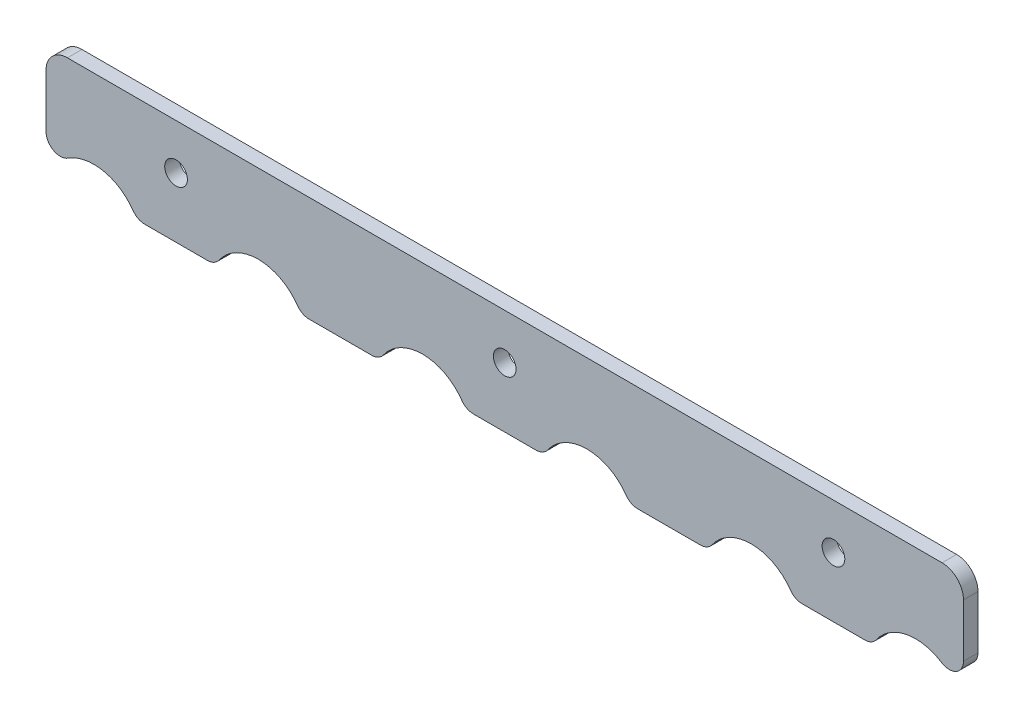
ISO-10303-21;
HEADER;
FILE_DESCRIPTION(('STEP AP214'),'2;1');
FILE_NAME('part.step','',(''),(''),'','','');
FILE_SCHEMA(('AUTOMOTIVE_DESIGN { 1 0 10303 214 1 1 1 1 }'));
ENDSEC;
DATA;
#1=APPLICATION_CONTEXT('core data for automotive mechanical design processes');
#2=APPLICATION_PROTOCOL_DEFINITION('international standard','automotive_design',2000,#1);
#3=PRODUCT_CONTEXT('',#1,'mechanical');
#4=PRODUCT('Part','Part','',(#3));
#5=PRODUCT_RELATED_PRODUCT_CATEGORY('part','',(#4));
#6=PRODUCT_DEFINITION_FORMATION('','',#4);
#7=PRODUCT_DEFINITION_CONTEXT('part definition',#1,'design');
#8=PRODUCT_DEFINITION('design','',#6,#7);
#9=PRODUCT_DEFINITION_SHAPE('','',#8);
#10=(LENGTH_UNIT() NAMED_UNIT(*) SI_UNIT(.MILLI.,.METRE.));
#11=(NAMED_UNIT(*) PLANE_ANGLE_UNIT() SI_UNIT($,.RADIAN.));
#12=(NAMED_UNIT(*) SI_UNIT($,.STERADIAN.) SOLID_ANGLE_UNIT());
#13=UNCERTAINTY_MEASURE_WITH_UNIT(LENGTH_MEASURE(1.E-05),#10,'distance_accuracy_value','');
#14=(GEOMETRIC_REPRESENTATION_CONTEXT(3) GLOBAL_UNCERTAINTY_ASSIGNED_CONTEXT((#13)) GLOBAL_UNIT_ASSIGNED_CONTEXT((#10,
#11,#12)) REPRESENTATION_CONTEXT('',''));
#15=CARTESIAN_POINT('',(0.,0.,0.));
#16=DIRECTION('',(0.,0.,1.));
#17=DIRECTION('',(1.,0.,0.));
#18=AXIS2_PLACEMENT_3D('',#15,#16,#17);
#19=CARTESIAN_POINT('',(125.775,10.775,2.032));
#20=DIRECTION('',(0.,0.,-1.));
#21=DIRECTION('',(-1.,0.,0.));
#22=AXIS2_PLACEMENT_3D('',#19,#20,#21);
#23=CYLINDRICAL_SURFACE('',#22,6.7);
#24=CARTESIAN_POINT('',(125.775,10.775,0.));
#25=DIRECTION('',(0.,0.,1.));
#26=DIRECTION('',(1.,0.,0.));
#27=AXIS2_PLACEMENT_3D('',#24,#25,#26);
#28=CIRCLE('',#27,6.7);
#29=CARTESIAN_POINT('',(129.394540229885,16.41316712454,0.));
#30=VERTEX_POINT('',#29);
#31=CARTESIAN_POINT('',(120.292019571223,14.6255747126437,0.));
#32=VERTEX_POINT('',#31);
#33=EDGE_CURVE('E464',#30,#32,#28,.T.);
#34=ORIENTED_EDGE('',*,*,#33,.F.);
#35=DIRECTION('',(0.,0.,-1.));
#36=VECTOR('',#35,1.);
#37=CARTESIAN_POINT('',(129.394540229885,16.41316712454,2.032));
#38=LINE('',#37,#36);
#39=CARTESIAN_POINT('',(129.394540229885,16.41316712454,2.032));
#40=VERTEX_POINT('',#39);
#41=EDGE_CURVE('E306',#30,#40,#38,.F.);
#42=ORIENTED_EDGE('',*,*,#41,.T.);
#43=CARTESIAN_POINT('',(125.775,10.775,2.032));
#44=DIRECTION('',(0.,0.,1.));
#45=DIRECTION('',(1.,0.,0.));
#46=AXIS2_PLACEMENT_3D('',#43,#44,#45);
#47=CIRCLE('',#46,6.7);
#48=CARTESIAN_POINT('',(120.292019571223,14.6255747126437,2.032));
#49=VERTEX_POINT('',#48);
#50=EDGE_CURVE('E411',#40,#49,#47,.T.);
#51=ORIENTED_EDGE('',*,*,#50,.T.);
#52=DIRECTION('',(0.,0.,-1.));
#53=VECTOR('',#52,1.);
#54=CARTESIAN_POINT('',(120.292019571223,14.6255747126437,2.032));
#55=LINE('',#54,#53);
#56=EDGE_CURVE('E303',#49,#32,#55,.T.);
#57=ORIENTED_EDGE('',*,*,#56,.T.);
#58=EDGE_LOOP('',(#34,#42,#51,#57));
#59=FACE_BOUND('',#58,.T.);
#60=ADVANCED_FACE('F43',(#59),#23,.F.);
#61=CARTESIAN_POINT('',(132.475,0.,2.032));
#62=DIRECTION('',(1.,0.,0.));
#63=DIRECTION('',(0.,0.,-1.));
#64=AXIS2_PLACEMENT_3D('',#61,#62,#63);
#65=PLANE('',#64);
#66=DIRECTION('',(0.,-1.,0.));
#67=VECTOR('',#66,1.);
#68=CARTESIAN_POINT('',(132.475,0.,2.032));
#69=LINE('',#68,#67);
#70=CARTESIAN_POINT('',(132.475,25.535,2.032));
#71=VERTEX_POINT('',#70);
#72=CARTESIAN_POINT('',(132.475,18.0962020870892,2.032));
#73=VERTEX_POINT('',#72);
#74=EDGE_CURVE('E415',#71,#73,#69,.T.);
#75=ORIENTED_EDGE('',*,*,#74,.T.);
#76=DIRECTION('',(0.,0.,-1.));
#77=VECTOR('',#76,1.);
#78=CARTESIAN_POINT('',(132.475,18.0962020870892,2.032));
#79=LINE('',#78,#77);
#80=CARTESIAN_POINT('',(132.475,18.0962020870892,0.));
#81=VERTEX_POINT('',#80);
#82=EDGE_CURVE('E277',#73,#81,#79,.T.);
#83=ORIENTED_EDGE('',*,*,#82,.T.);
#84=DIRECTION('',(0.,-1.,0.));
#85=VECTOR('',#84,1.);
#86=CARTESIAN_POINT('',(132.475,0.,0.));
#87=LINE('',#86,#85);
#88=CARTESIAN_POINT('',(132.475,25.535,0.));
#89=VERTEX_POINT('',#88);
#90=EDGE_CURVE('E467',#89,#81,#87,.T.);
#91=ORIENTED_EDGE('',*,*,#90,.F.);
#92=DIRECTION('',(0.,0.,-1.));
#93=VECTOR('',#92,1.);
#94=CARTESIAN_POINT('',(132.475,25.535,2.032));
#95=LINE('',#94,#93);
#96=EDGE_CURVE('E275',#89,#71,#95,.F.);
#97=ORIENTED_EDGE('',*,*,#96,.T.);
#98=EDGE_LOOP('',(#75,#83,#91,#97));
#99=FACE_BOUND('',#98,.T.);
#100=ADVANCED_FACE('F484',(#99),#65,.T.);
#101=CARTESIAN_POINT('',(0.,28.535,2.032));
#102=DIRECTION('',(0.,1.,0.));
#103=DIRECTION('',(0.,0.,1.));
#104=AXIS2_PLACEMENT_3D('',#101,#102,#103);
#105=PLANE('',#104);
#106=DIRECTION('',(1.,0.,0.));
#107=VECTOR('',#106,1.);
#108=CARTESIAN_POINT('',(0.,28.535,0.));
#109=LINE('',#108,#107);
#110=CARTESIAN_POINT('',(7.075,28.535,0.));
#111=VERTEX_POINT('',#110);
#112=CARTESIAN_POINT('',(129.475,28.535,0.));
#113=VERTEX_POINT('',#112);
#114=EDGE_CURVE('E241',#111,#113,#109,.T.);
#115=ORIENTED_EDGE('',*,*,#114,.F.);
#116=DIRECTION('',(0.,0.,-1.));
#117=VECTOR('',#116,1.);
#118=CARTESIAN_POINT('',(7.075,28.535,2.032));
#119=LINE('',#118,#117);
#120=CARTESIAN_POINT('',(7.075,28.535,2.032));
#121=VERTEX_POINT('',#120);
#122=EDGE_CURVE('E249',#111,#121,#119,.F.);
#123=ORIENTED_EDGE('',*,*,#122,.T.);
#124=DIRECTION('',(1.,0.,0.));
#125=VECTOR('',#124,1.);
#126=CARTESIAN_POINT('',(0.,28.535,2.032));
#127=LINE('',#126,#125);
#128=CARTESIAN_POINT('',(129.475,28.535,2.032));
#129=VERTEX_POINT('',#128);
#130=EDGE_CURVE('E476',#121,#129,#127,.T.);
#131=ORIENTED_EDGE('',*,*,#130,.T.);
#132=DIRECTION('',(0.,0.,-1.));
#133=VECTOR('',#132,1.);
#134=CARTESIAN_POINT('',(129.475,28.535,2.032));
#135=LINE('',#134,#133);
#136=EDGE_CURVE('E250',#129,#113,#135,.T.);
#137=ORIENTED_EDGE('',*,*,#136,.T.);
#138=EDGE_LOOP('',(#115,#123,#131,#137));
#139=FACE_BOUND('',#138,.T.);
#140=ADVANCED_FACE('F472',(#139),#105,.T.);
#141=CARTESIAN_POINT('',(4.075,0.,2.032));
#142=DIRECTION('',(-1.,0.,0.));
#143=DIRECTION('',(0.,0.,1.));
#144=AXIS2_PLACEMENT_3D('',#141,#142,#143);
#145=PLANE('',#144);
#146=DIRECTION('',(0.,1.,0.));
#147=VECTOR('',#146,1.);
#148=CARTESIAN_POINT('',(4.075,0.,0.));
#149=LINE('',#148,#147);
#150=CARTESIAN_POINT('',(4.075,18.0962020870892,0.));
#151=VERTEX_POINT('',#150);
#152=CARTESIAN_POINT('',(4.075,25.535,0.));
#153=VERTEX_POINT('',#152);
#154=EDGE_CURVE('E228',#151,#153,#149,.T.);
#155=ORIENTED_EDGE('',*,*,#154,.F.);
#156=DIRECTION('',(0.,0.,-1.));
#157=VECTOR('',#156,1.);
#158=CARTESIAN_POINT('',(4.075,18.0962020870892,2.032));
#159=LINE('',#158,#157);
#160=CARTESIAN_POINT('',(4.075,18.0962020870892,2.032));
#161=VERTEX_POINT('',#160);
#162=EDGE_CURVE('E11',#151,#161,#159,.F.);
#163=ORIENTED_EDGE('',*,*,#162,.T.);
#164=DIRECTION('',(0.,1.,0.));
#165=VECTOR('',#164,1.);
#166=CARTESIAN_POINT('',(4.075,0.,2.032));
#167=LINE('',#166,#165);
#168=CARTESIAN_POINT('',(4.075,25.535,2.032));
#169=VERTEX_POINT('',#168);
#170=EDGE_CURVE('E255',#161,#169,#167,.T.);
#171=ORIENTED_EDGE('',*,*,#170,.T.);
#172=DIRECTION('',(0.,0.,-1.));
#173=VECTOR('',#172,1.);
#174=CARTESIAN_POINT('',(4.075,25.535,2.032));
#175=LINE('',#174,#173);
#176=EDGE_CURVE('E248',#169,#153,#175,.T.);
#177=ORIENTED_EDGE('',*,*,#176,.T.);
#178=EDGE_LOOP('',(#155,#163,#171,#177));
#179=FACE_BOUND('',#178,.T.);
#180=ADVANCED_FACE('F253',(#179),#145,.T.);
#181=CARTESIAN_POINT('',(10.775,10.775,2.032));
#182=DIRECTION('',(0.,0.,-1.));
#183=DIRECTION('',(-1.,0.,0.));
#184=AXIS2_PLACEMENT_3D('',#181,#182,#183);
#185=CYLINDRICAL_SURFACE('',#184,6.7);
#186=CARTESIAN_POINT('',(10.775,10.775,0.));
#187=DIRECTION('',(0.,0.,1.));
#188=DIRECTION('',(1.,0.,0.));
#189=AXIS2_PLACEMENT_3D('',#186,#187,#188);
#190=CIRCLE('',#189,6.7);
#191=CARTESIAN_POINT('',(16.2579804287768,14.6255747126437,0.));
#192=VERTEX_POINT('',#191);
#193=CARTESIAN_POINT('',(7.15545977011494,16.41316712454,0.));
#194=VERTEX_POINT('',#193);
#195=EDGE_CURVE('E240',#192,#194,#190,.T.);
#196=ORIENTED_EDGE('',*,*,#195,.F.);
#197=DIRECTION('',(0.,0.,-1.));
#198=VECTOR('',#197,1.);
#199=CARTESIAN_POINT('',(16.2579804287768,14.6255747126437,2.032));
#200=LINE('',#199,#198);
#201=CARTESIAN_POINT('',(16.2579804287768,14.6255747126437,2.032));
#202=VERTEX_POINT('',#201);
#203=EDGE_CURVE('E51',#192,#202,#200,.F.);
#204=ORIENTED_EDGE('',*,*,#203,.T.);
#205=CARTESIAN_POINT('',(10.775,10.775,2.032));
#206=DIRECTION('',(0.,0.,1.));
#207=DIRECTION('',(1.,0.,0.));
#208=AXIS2_PLACEMENT_3D('',#205,#206,#207);
#209=CIRCLE('',#208,6.7);
#210=CARTESIAN_POINT('',(7.15545977011494,16.41316712454,2.032));
#211=VERTEX_POINT('',#210);
#212=EDGE_CURVE('E383',#202,#211,#209,.T.);
#213=ORIENTED_EDGE('',*,*,#212,.T.);
#214=DIRECTION('',(0.,0.,-1.));
#215=VECTOR('',#214,1.);
#216=CARTESIAN_POINT('',(7.15545977011494,16.41316712454,2.032));
#217=LINE('',#216,#215);
#218=EDGE_CURVE('E375',#211,#194,#217,.T.);
#219=ORIENTED_EDGE('',*,*,#218,.T.);
#220=EDGE_LOOP('',(#196,#204,#213,#219));
#221=FACE_BOUND('',#220,.T.);
#222=ADVANCED_FACE('F382',(#221),#185,.F.);
#223=CARTESIAN_POINT('',(0.,13.775,2.032));
#224=DIRECTION('',(0.,1.,0.));
#225=DIRECTION('',(0.,0.,1.));
#226=AXIS2_PLACEMENT_3D('',#223,#224,#225);
#227=PLANE('',#226);
#228=DIRECTION('',(1.,0.,0.));
#229=VECTOR('',#228,1.);
#230=CARTESIAN_POINT('',(0.,13.775,0.));
#231=LINE('',#230,#229);
#232=CARTESIAN_POINT('',(17.894691004531,13.775,0.));
#233=VERTEX_POINT('',#232);
#234=CARTESIAN_POINT('',(26.655308995469,13.775,0.));
#235=VERTEX_POINT('',#234);
#236=EDGE_CURVE('E399',#233,#235,#231,.T.);
#237=ORIENTED_EDGE('',*,*,#236,.T.);
#238=DIRECTION('',(0.,0.,1.));
#239=VECTOR('',#238,1.);
#240=CARTESIAN_POINT('',(26.655308995469,13.775,2.032));
#241=LINE('',#240,#239);
#242=CARTESIAN_POINT('',(26.655308995469,13.775,2.032));
#243=VERTEX_POINT('',#242);
#244=EDGE_CURVE('E373',#235,#243,#241,.T.);
#245=ORIENTED_EDGE('',*,*,#244,.T.);
#246=DIRECTION('',(1.,0.,0.));
#247=VECTOR('',#246,1.);
#248=CARTESIAN_POINT('',(0.,13.775,2.032));
#249=LINE('',#248,#247);
#250=CARTESIAN_POINT('',(17.894691004531,13.775,2.032));
#251=VERTEX_POINT('',#250);
#252=EDGE_CURVE('E263',#251,#243,#249,.T.);
#253=ORIENTED_EDGE('',*,*,#252,.F.);
#254=DIRECTION('',(0.,0.,1.));
#255=VECTOR('',#254,1.);
#256=CARTESIAN_POINT('',(17.894691004531,13.775,0.));
#257=LINE('',#256,#255);
#258=EDGE_CURVE('E370',#251,#233,#257,.F.);
#259=ORIENTED_EDGE('',*,*,#258,.T.);
#260=EDGE_LOOP('',(#237,#245,#253,#259));
#261=FACE_BOUND('',#260,.T.);
#262=ADVANCED_FACE('F398',(#261),#227,.F.);
#263=CARTESIAN_POINT('',(33.775,10.775,2.032));
#264=DIRECTION('',(0.,0.,-1.));
#265=DIRECTION('',(-1.,0.,0.));
#266=AXIS2_PLACEMENT_3D('',#263,#264,#265);
#267=CYLINDRICAL_SURFACE('',#266,6.7);
#268=CARTESIAN_POINT('',(33.775,10.775,0.));
#269=DIRECTION('',(0.,0.,1.));
#270=DIRECTION('',(1.,0.,0.));
#271=AXIS2_PLACEMENT_3D('',#268,#269,#270);
#272=CIRCLE('',#271,6.7);
#273=CARTESIAN_POINT('',(39.2579804287768,14.6255747126437,0.));
#274=VERTEX_POINT('',#273);
#275=CARTESIAN_POINT('',(28.2920195712232,14.6255747126437,0.));
#276=VERTEX_POINT('',#275);
#277=EDGE_CURVE('E402',#274,#276,#272,.T.);
#278=ORIENTED_EDGE('',*,*,#277,.F.);
#279=DIRECTION('',(0.,0.,-1.));
#280=VECTOR('',#279,1.);
#281=CARTESIAN_POINT('',(39.2579804287768,14.6255747126437,2.032));
#282=LINE('',#281,#280);
#283=CARTESIAN_POINT('',(39.2579804287768,14.6255747126437,2.032));
#284=VERTEX_POINT('',#283);
#285=EDGE_CURVE('E368',#274,#284,#282,.F.);
#286=ORIENTED_EDGE('',*,*,#285,.T.);
#287=CARTESIAN_POINT('',(33.775,10.775,2.032));
#288=DIRECTION('',(0.,0.,1.));
#289=DIRECTION('',(1.,0.,0.));
#290=AXIS2_PLACEMENT_3D('',#287,#288,#289);
#291=CIRCLE('',#290,6.7);
#292=CARTESIAN_POINT('',(28.2920195712232,14.6255747126437,2.032));
#293=VERTEX_POINT('',#292);
#294=EDGE_CURVE('E455',#284,#293,#291,.T.);
#295=ORIENTED_EDGE('',*,*,#294,.T.);
#296=DIRECTION('',(0.,0.,-1.));
#297=VECTOR('',#296,1.);
#298=CARTESIAN_POINT('',(28.2920195712232,14.6255747126437,2.032));
#299=LINE('',#298,#297);
#300=EDGE_CURVE('E365',#293,#276,#299,.T.);
#301=ORIENTED_EDGE('',*,*,#300,.T.);
#302=EDGE_LOOP('',(#278,#286,#295,#301));
#303=FACE_BOUND('',#302,.T.);
#304=ADVANCED_FACE('F757',(#303),#267,.F.);
#305=CARTESIAN_POINT('',(40.894691004531,13.775,0.));
#306=VERTEX_POINT('',#305);
#307=CARTESIAN_POINT('',(49.655308995469,13.775,0.));
#308=VERTEX_POINT('',#307);
#309=EDGE_CURVE('E404',#306,#308,#231,.T.);
#310=ORIENTED_EDGE('',*,*,#309,.T.);
#311=DIRECTION('',(0.,0.,1.));
#312=VECTOR('',#311,1.);
#313=CARTESIAN_POINT('',(49.655308995469,13.775,2.032));
#314=LINE('',#313,#312);
#315=CARTESIAN_POINT('',(49.655308995469,13.775,2.032));
#316=VERTEX_POINT('',#315);
#317=EDGE_CURVE('E363',#308,#316,#314,.T.);
#318=ORIENTED_EDGE('',*,*,#317,.T.);
#319=CARTESIAN_POINT('',(40.894691004531,13.775,2.032));
#320=VERTEX_POINT('',#319);
#321=EDGE_CURVE('E449',#320,#316,#249,.T.);
#322=ORIENTED_EDGE('',*,*,#321,.F.);
#323=DIRECTION('',(0.,0.,1.));
#324=VECTOR('',#323,1.);
#325=CARTESIAN_POINT('',(40.894691004531,13.775,0.));
#326=LINE('',#325,#324);
#327=EDGE_CURVE('E360',#320,#306,#326,.F.);
#328=ORIENTED_EDGE('',*,*,#327,.T.);
#329=EDGE_LOOP('',(#310,#318,#322,#328));
#330=FACE_BOUND('',#329,.T.);
#331=ADVANCED_FACE('F743',(#330),#227,.F.);
#332=CARTESIAN_POINT('',(56.775,10.775,2.032));
#333=DIRECTION('',(0.,0.,-1.));
#334=DIRECTION('',(-1.,0.,0.));
#335=AXIS2_PLACEMENT_3D('',#332,#333,#334);
#336=CYLINDRICAL_SURFACE('',#335,6.70000000000001);
#337=CARTESIAN_POINT('',(56.775,10.775,0.));
#338=DIRECTION('',(0.,0.,1.));
#339=DIRECTION('',(1.,0.,0.));
#340=AXIS2_PLACEMENT_3D('',#337,#338,#339);
#341=CIRCLE('',#340,6.70000000000001);
#342=CARTESIAN_POINT('',(62.2579804287768,14.6255747126437,0.));
#343=VERTEX_POINT('',#342);
#344=CARTESIAN_POINT('',(51.2920195712232,14.6255747126437,0.));
#345=VERTEX_POINT('',#344);
#346=EDGE_CURVE('E409',#343,#345,#341,.T.);
#347=ORIENTED_EDGE('',*,*,#346,.F.);
#348=DIRECTION('',(0.,0.,-1.));
#349=VECTOR('',#348,1.);
#350=CARTESIAN_POINT('',(62.2579804287768,14.6255747126437,2.032));
#351=LINE('',#350,#349);
#352=CARTESIAN_POINT('',(62.2579804287768,14.6255747126437,2.032));
#353=VERTEX_POINT('',#352);
#354=EDGE_CURVE('E358',#343,#353,#351,.F.);
#355=ORIENTED_EDGE('',*,*,#354,.T.);
#356=CARTESIAN_POINT('',(56.775,10.775,2.032));
#357=DIRECTION('',(0.,0.,1.));
#358=DIRECTION('',(1.,0.,0.));
#359=AXIS2_PLACEMENT_3D('',#356,#357,#358);
#360=CIRCLE('',#359,6.70000000000001);
#361=CARTESIAN_POINT('',(51.2920195712232,14.6255747126437,2.032));
#362=VERTEX_POINT('',#361);
#363=EDGE_CURVE('E446',#353,#362,#360,.T.);
#364=ORIENTED_EDGE('',*,*,#363,.T.);
#365=DIRECTION('',(0.,0.,-1.));
#366=VECTOR('',#365,1.);
#367=CARTESIAN_POINT('',(51.2920195712232,14.6255747126437,2.032));
#368=LINE('',#367,#366);
#369=EDGE_CURVE('E355',#362,#345,#368,.T.);
#370=ORIENTED_EDGE('',*,*,#369,.T.);
#371=EDGE_LOOP('',(#347,#355,#364,#370));
#372=FACE_BOUND('',#371,.T.);
#373=ADVANCED_FACE('F434',(#372),#336,.F.);
#374=CARTESIAN_POINT('',(63.894691004531,13.775,0.));
#375=VERTEX_POINT('',#374);
#376=CARTESIAN_POINT('',(72.655308995469,13.775,0.));
#377=VERTEX_POINT('',#376);
#378=EDGE_CURVE('E410',#375,#377,#231,.T.);
#379=ORIENTED_EDGE('',*,*,#378,.T.);
#380=DIRECTION('',(0.,0.,1.));
#381=VECTOR('',#380,1.);
#382=CARTESIAN_POINT('',(72.655308995469,13.775,2.032));
#383=LINE('',#382,#381);
#384=CARTESIAN_POINT('',(72.655308995469,13.775,2.032));
#385=VERTEX_POINT('',#384);
#386=EDGE_CURVE('E353',#377,#385,#383,.T.);
#387=ORIENTED_EDGE('',*,*,#386,.T.);
#388=CARTESIAN_POINT('',(63.894691004531,13.775,2.032));
#389=VERTEX_POINT('',#388);
#390=EDGE_CURVE('E444',#389,#385,#249,.T.);
#391=ORIENTED_EDGE('',*,*,#390,.F.);
#392=DIRECTION('',(0.,0.,1.));
#393=VECTOR('',#392,1.);
#394=CARTESIAN_POINT('',(63.894691004531,13.775,0.));
#395=LINE('',#394,#393);
#396=EDGE_CURVE('E350',#389,#375,#395,.F.);
#397=ORIENTED_EDGE('',*,*,#396,.T.);
#398=EDGE_LOOP('',(#379,#387,#391,#397));
#399=FACE_BOUND('',#398,.T.);
#400=ADVANCED_FACE('F447',(#399),#227,.F.);
#401=CARTESIAN_POINT('',(79.775,10.775,2.032));
#402=DIRECTION('',(0.,0.,-1.));
#403=DIRECTION('',(-1.,0.,0.));
#404=AXIS2_PLACEMENT_3D('',#401,#402,#403);
#405=CYLINDRICAL_SURFACE('',#404,6.7);
#406=CARTESIAN_POINT('',(79.775,10.775,0.));
#407=DIRECTION('',(0.,0.,1.));
#408=DIRECTION('',(1.,0.,0.));
#409=AXIS2_PLACEMENT_3D('',#406,#407,#408);
#410=CIRCLE('',#409,6.7);
#411=CARTESIAN_POINT('',(85.2579804287768,14.6255747126437,0.));
#412=VERTEX_POINT('',#411);
#413=CARTESIAN_POINT('',(74.2920195712232,14.6255747126437,0.));
#414=VERTEX_POINT('',#413);
#415=EDGE_CURVE('E419',#412,#414,#410,.T.);
#416=ORIENTED_EDGE('',*,*,#415,.F.);
#417=DIRECTION('',(0.,0.,-1.));
#418=VECTOR('',#417,1.);
#419=CARTESIAN_POINT('',(85.2579804287768,14.6255747126437,2.032));
#420=LINE('',#419,#418);
#421=CARTESIAN_POINT('',(85.2579804287768,14.6255747126437,2.032));
#422=VERTEX_POINT('',#421);
#423=EDGE_CURVE('E348',#412,#422,#420,.F.);
#424=ORIENTED_EDGE('',*,*,#423,.T.);
#425=CARTESIAN_POINT('',(79.775,10.775,2.032));
#426=DIRECTION('',(0.,0.,1.));
#427=DIRECTION('',(1.,0.,0.));
#428=AXIS2_PLACEMENT_3D('',#425,#426,#427);
#429=CIRCLE('',#428,6.7);
#430=CARTESIAN_POINT('',(74.2920195712232,14.6255747126437,2.032));
#431=VERTEX_POINT('',#430);
#432=EDGE_CURVE('E448',#422,#431,#429,.T.);
#433=ORIENTED_EDGE('',*,*,#432,.T.);
#434=DIRECTION('',(0.,0.,-1.));
#435=VECTOR('',#434,1.);
#436=CARTESIAN_POINT('',(74.2920195712232,14.6255747126437,2.032));
#437=LINE('',#436,#435);
#438=EDGE_CURVE('E345',#431,#414,#437,.T.);
#439=ORIENTED_EDGE('',*,*,#438,.T.);
#440=EDGE_LOOP('',(#416,#424,#433,#439));
#441=FACE_BOUND('',#440,.T.);
#442=ADVANCED_FACE('F728',(#441),#405,.F.);
#443=CARTESIAN_POINT('',(86.894691004531,13.775,0.));
#444=VERTEX_POINT('',#443);
#445=CARTESIAN_POINT('',(95.655308995469,13.775,0.));
#446=VERTEX_POINT('',#445);
#447=EDGE_CURVE('E412',#444,#446,#231,.T.);
#448=ORIENTED_EDGE('',*,*,#447,.T.);
#449=DIRECTION('',(0.,0.,1.));
#450=VECTOR('',#449,1.);
#451=CARTESIAN_POINT('',(95.655308995469,13.775,2.032));
#452=LINE('',#451,#450);
#453=CARTESIAN_POINT('',(95.655308995469,13.775,2.032));
#454=VERTEX_POINT('',#453);
#455=EDGE_CURVE('E343',#446,#454,#452,.T.);
#456=ORIENTED_EDGE('',*,*,#455,.T.);
#457=CARTESIAN_POINT('',(86.894691004531,13.775,2.032));
#458=VERTEX_POINT('',#457);
#459=EDGE_CURVE('E262',#458,#454,#249,.T.);
#460=ORIENTED_EDGE('',*,*,#459,.F.);
#461=DIRECTION('',(0.,0.,1.));
#462=VECTOR('',#461,1.);
#463=CARTESIAN_POINT('',(86.894691004531,13.775,0.));
#464=LINE('',#463,#462);
#465=EDGE_CURVE('E340',#458,#444,#464,.F.);
#466=ORIENTED_EDGE('',*,*,#465,.T.);
#467=EDGE_LOOP('',(#448,#456,#460,#466));
#468=FACE_BOUND('',#467,.T.);
#469=ADVANCED_FACE('F713',(#468),#227,.F.);
#470=CARTESIAN_POINT('',(102.775,10.775,2.032));
#471=DIRECTION('',(0.,0.,-1.));
#472=DIRECTION('',(-1.,0.,0.));
#473=AXIS2_PLACEMENT_3D('',#470,#471,#472);
#474=CYLINDRICAL_SURFACE('',#473,6.7);
#475=CARTESIAN_POINT('',(102.775,10.775,0.));
#476=DIRECTION('',(0.,0.,1.));
#477=DIRECTION('',(1.,0.,0.));
#478=AXIS2_PLACEMENT_3D('',#475,#476,#477);
#479=CIRCLE('',#478,6.7);
#480=CARTESIAN_POINT('',(108.257980428777,14.6255747126437,0.));
#481=VERTEX_POINT('',#480);
#482=CARTESIAN_POINT('',(97.2920195712232,14.6255747126437,0.));
#483=VERTEX_POINT('',#482);
#484=EDGE_CURVE('E265',#481,#483,#479,.T.);
#485=ORIENTED_EDGE('',*,*,#484,.F.);
#486=DIRECTION('',(0.,0.,-1.));
#487=VECTOR('',#486,1.);
#488=CARTESIAN_POINT('',(108.257980428777,14.6255747126437,2.032));
#489=LINE('',#488,#487);
#490=CARTESIAN_POINT('',(108.257980428777,14.6255747126437,2.032));
#491=VERTEX_POINT('',#490);
#492=EDGE_CURVE('E338',#481,#491,#489,.F.);
#493=ORIENTED_EDGE('',*,*,#492,.T.);
#494=CARTESIAN_POINT('',(102.775,10.775,2.032));
#495=DIRECTION('',(0.,0.,1.));
#496=DIRECTION('',(1.,0.,0.));
#497=AXIS2_PLACEMENT_3D('',#494,#495,#496);
#498=CIRCLE('',#497,6.7);
#499=CARTESIAN_POINT('',(97.2920195712232,14.6255747126437,2.032));
#500=VERTEX_POINT('',#499);
#501=EDGE_CURVE('E260',#491,#500,#498,.T.);
#502=ORIENTED_EDGE('',*,*,#501,.T.);
#503=DIRECTION('',(0.,0.,-1.));
#504=VECTOR('',#503,1.);
#505=CARTESIAN_POINT('',(97.2920195712232,14.6255747126437,2.032));
#506=LINE('',#505,#504);
#507=EDGE_CURVE('E335',#500,#483,#506,.T.);
#508=ORIENTED_EDGE('',*,*,#507,.T.);
#509=EDGE_LOOP('',(#485,#493,#502,#508));
#510=FACE_BOUND('',#509,.T.);
#511=ADVANCED_FACE('F711',(#510),#474,.F.);
#512=CARTESIAN_POINT('',(109.894691004531,13.775,0.));
#513=VERTEX_POINT('',#512);
#514=CARTESIAN_POINT('',(118.655308995469,13.775,0.));
#515=VERTEX_POINT('',#514);
#516=EDGE_CURVE('E405',#513,#515,#231,.T.);
#517=ORIENTED_EDGE('',*,*,#516,.T.);
#518=DIRECTION('',(0.,0.,1.));
#519=VECTOR('',#518,1.);
#520=CARTESIAN_POINT('',(118.655308995469,13.775,2.032));
#521=LINE('',#520,#519);
#522=CARTESIAN_POINT('',(118.655308995469,13.775,2.032));
#523=VERTEX_POINT('',#522);
#524=EDGE_CURVE('E58',#515,#523,#521,.T.);
#525=ORIENTED_EDGE('',*,*,#524,.T.);
#526=CARTESIAN_POINT('',(109.894691004531,13.775,2.032));
#527=VERTEX_POINT('',#526);
#528=EDGE_CURVE('E257',#527,#523,#249,.T.);
#529=ORIENTED_EDGE('',*,*,#528,.F.);
#530=DIRECTION('',(0.,0.,1.));
#531=VECTOR('',#530,1.);
#532=CARTESIAN_POINT('',(109.894691004531,13.775,0.));
#533=LINE('',#532,#531);
#534=EDGE_CURVE('E331',#527,#513,#533,.F.);
#535=ORIENTED_EDGE('',*,*,#534,.T.);
#536=EDGE_LOOP('',(#517,#525,#529,#535));
#537=FACE_BOUND('',#536,.T.);
#538=ADVANCED_FACE('F605',(#537),#227,.F.);
#539=CARTESIAN_POINT('',(0.,0.,2.032));
#540=DIRECTION('',(0.,0.,1.));
#541=DIRECTION('',(1.,0.,0.));
#542=AXIS2_PLACEMENT_3D('',#539,#540,#541);
#543=PLANE('',#542);
#544=CARTESIAN_POINT('',(22.275,22.185,2.032));
#545=DIRECTION('',(0.,0.,-1.));
#546=DIRECTION('',(-1.,0.,0.));
#547=AXIS2_PLACEMENT_3D('',#544,#545,#546);
#548=CIRCLE('',#547,1.5875);
#549=CARTESIAN_POINT('',(20.6875,22.185,2.032));
#550=VERTEX_POINT('',#549);
#551=EDGE_CURVE('E468',#550,#550,#548,.T.);
#552=ORIENTED_EDGE('',*,*,#551,.T.);
#553=EDGE_LOOP('',(#552));
#554=FACE_BOUND('',#553,.T.);
#555=CARTESIAN_POINT('',(68.275,22.185,2.032));
#556=DIRECTION('',(0.,0.,-1.));
#557=DIRECTION('',(-1.,0.,0.));
#558=AXIS2_PLACEMENT_3D('',#555,#556,#557);
#559=CIRCLE('',#558,1.58749999999999);
#560=CARTESIAN_POINT('',(66.6875,22.185,2.032));
#561=VERTEX_POINT('',#560);
#562=EDGE_CURVE('E497',#561,#561,#559,.T.);
#563=ORIENTED_EDGE('',*,*,#562,.T.);
#564=EDGE_LOOP('',(#563));
#565=FACE_BOUND('',#564,.T.);
#566=CARTESIAN_POINT('',(114.275,22.185,2.032));
#567=DIRECTION('',(0.,0.,-1.));
#568=DIRECTION('',(-1.,0.,0.));
#569=AXIS2_PLACEMENT_3D('',#566,#567,#568);
#570=CIRCLE('',#569,1.5875);
#571=CARTESIAN_POINT('',(112.6875,22.185,2.032));
#572=VERTEX_POINT('',#571);
#573=EDGE_CURVE('E491',#572,#572,#570,.T.);
#574=ORIENTED_EDGE('',*,*,#573,.T.);
#575=EDGE_LOOP('',(#574));
#576=FACE_BOUND('',#575,.T.);
#577=ORIENTED_EDGE('',*,*,#50,.F.);
#578=CARTESIAN_POINT('',(130.475,18.0962020870892,2.032));
#579=DIRECTION('',(0.,0.,1.));
#580=DIRECTION('',(1.,0.,0.));
#581=AXIS2_PLACEMENT_3D('',#578,#579,#580);
#582=CIRCLE('',#581,2.);
#583=EDGE_CURVE('E329',#40,#73,#582,.T.);
#584=ORIENTED_EDGE('',*,*,#583,.T.);
#585=ORIENTED_EDGE('',*,*,#74,.F.);
#586=CARTESIAN_POINT('',(129.475,25.535,2.032));
#587=DIRECTION('',(0.,0.,1.));
#588=DIRECTION('',(1.,0.,0.));
#589=AXIS2_PLACEMENT_3D('',#586,#587,#588);
#590=CIRCLE('',#589,3.);
#591=EDGE_CURVE('E271',#71,#129,#590,.T.);
#592=ORIENTED_EDGE('',*,*,#591,.T.);
#593=ORIENTED_EDGE('',*,*,#130,.F.);
#594=CARTESIAN_POINT('',(7.075,25.535,2.032));
#595=DIRECTION('',(0.,0.,1.));
#596=DIRECTION('',(1.,0.,0.));
#597=AXIS2_PLACEMENT_3D('',#594,#595,#596);
#598=CIRCLE('',#597,3.);
#599=EDGE_CURVE('E273',#121,#169,#598,.T.);
#600=ORIENTED_EDGE('',*,*,#599,.T.);
#601=ORIENTED_EDGE('',*,*,#170,.F.);
#602=CARTESIAN_POINT('',(6.075,18.0962020870892,2.032));
#603=DIRECTION('',(0.,0.,1.));
#604=DIRECTION('',(1.,0.,0.));
#605=AXIS2_PLACEMENT_3D('',#602,#603,#604);
#606=CIRCLE('',#605,2.);
#607=EDGE_CURVE('E308',#161,#211,#606,.T.);
#608=ORIENTED_EDGE('',*,*,#607,.T.);
#609=ORIENTED_EDGE('',*,*,#212,.F.);
#610=CARTESIAN_POINT('',(17.894691004531,15.775,2.032));
#611=DIRECTION('',(0.,0.,1.));
#612=DIRECTION('',(1.,0.,0.));
#613=AXIS2_PLACEMENT_3D('',#610,#611,#612);
#614=CIRCLE('',#613,2.);
#615=EDGE_CURVE('E310',#202,#251,#614,.T.);
#616=ORIENTED_EDGE('',*,*,#615,.T.);
#617=ORIENTED_EDGE('',*,*,#252,.T.);
#618=CARTESIAN_POINT('',(26.655308995469,15.775,2.032));
#619=DIRECTION('',(0.,0.,1.));
#620=DIRECTION('',(1.,0.,0.));
#621=AXIS2_PLACEMENT_3D('',#618,#619,#620);
#622=CIRCLE('',#621,2.);
#623=EDGE_CURVE('E312',#243,#293,#622,.T.);
#624=ORIENTED_EDGE('',*,*,#623,.T.);
#625=ORIENTED_EDGE('',*,*,#294,.F.);
#626=CARTESIAN_POINT('',(40.894691004531,15.775,2.032));
#627=DIRECTION('',(0.,0.,1.));
#628=DIRECTION('',(1.,0.,0.));
#629=AXIS2_PLACEMENT_3D('',#626,#627,#628);
#630=CIRCLE('',#629,2.);
#631=EDGE_CURVE('E314',#284,#320,#630,.T.);
#632=ORIENTED_EDGE('',*,*,#631,.T.);
#633=ORIENTED_EDGE('',*,*,#321,.T.);
#634=CARTESIAN_POINT('',(49.655308995469,15.775,2.032));
#635=DIRECTION('',(0.,0.,1.));
#636=DIRECTION('',(1.,0.,0.));
#637=AXIS2_PLACEMENT_3D('',#634,#635,#636);
#638=CIRCLE('',#637,2.);
#639=EDGE_CURVE('E316',#316,#362,#638,.T.);
#640=ORIENTED_EDGE('',*,*,#639,.T.);
#641=ORIENTED_EDGE('',*,*,#363,.F.);
#642=CARTESIAN_POINT('',(63.894691004531,15.775,2.032));
#643=DIRECTION('',(0.,0.,1.));
#644=DIRECTION('',(1.,0.,0.));
#645=AXIS2_PLACEMENT_3D('',#642,#643,#644);
#646=CIRCLE('',#645,2.);
#647=EDGE_CURVE('E318',#353,#389,#646,.T.);
#648=ORIENTED_EDGE('',*,*,#647,.T.);
#649=ORIENTED_EDGE('',*,*,#390,.T.);
#650=CARTESIAN_POINT('',(72.655308995469,15.775,2.032));
#651=DIRECTION('',(0.,0.,1.));
#652=DIRECTION('',(1.,0.,0.));
#653=AXIS2_PLACEMENT_3D('',#650,#651,#652);
#654=CIRCLE('',#653,2.);
#655=EDGE_CURVE('E320',#385,#431,#654,.T.);
#656=ORIENTED_EDGE('',*,*,#655,.T.);
#657=ORIENTED_EDGE('',*,*,#432,.F.);
#658=CARTESIAN_POINT('',(86.894691004531,15.775,2.032));
#659=DIRECTION('',(0.,0.,1.));
#660=DIRECTION('',(1.,0.,0.));
#661=AXIS2_PLACEMENT_3D('',#658,#659,#660);
#662=CIRCLE('',#661,2.);
#663=EDGE_CURVE('E322',#422,#458,#662,.T.);
#664=ORIENTED_EDGE('',*,*,#663,.T.);
#665=ORIENTED_EDGE('',*,*,#459,.T.);
#666=CARTESIAN_POINT('',(95.655308995469,15.775,2.032));
#667=DIRECTION('',(0.,0.,1.));
#668=DIRECTION('',(1.,0.,0.));
#669=AXIS2_PLACEMENT_3D('',#666,#667,#668);
#670=CIRCLE('',#669,2.);
#671=EDGE_CURVE('E324',#454,#500,#670,.T.);
#672=ORIENTED_EDGE('',*,*,#671,.T.);
#673=ORIENTED_EDGE('',*,*,#501,.F.);
#674=CARTESIAN_POINT('',(109.894691004531,15.775,2.032));
#675=DIRECTION('',(0.,0.,1.));
#676=DIRECTION('',(1.,0.,0.));
#677=AXIS2_PLACEMENT_3D('',#674,#675,#676);
#678=CIRCLE('',#677,2.);
#679=EDGE_CURVE('E65',#491,#527,#678,.T.);
#680=ORIENTED_EDGE('',*,*,#679,.T.);
#681=ORIENTED_EDGE('',*,*,#528,.T.);
#682=CARTESIAN_POINT('',(118.655308995469,15.775,2.032));
#683=DIRECTION('',(0.,0.,1.));
#684=DIRECTION('',(1.,0.,0.));
#685=AXIS2_PLACEMENT_3D('',#682,#683,#684);
#686=CIRCLE('',#685,2.);
#687=EDGE_CURVE('E327',#523,#49,#686,.T.);
#688=ORIENTED_EDGE('',*,*,#687,.T.);
#689=EDGE_LOOP('',(#577,#584,#585,#592,#593,#600,#601,#608,#609,#616,#617,#624,#625,#632,#633,
#640,#641,#648,#649,#656,#657,#664,#665,#672,#673,#680,#681,#688));
#690=FACE_BOUND('',#689,.T.);
#691=ADVANCED_FACE('F388',(#554,#565,#576,#690),#543,.T.);
#692=CARTESIAN_POINT('',(0.,0.,0.));
#693=DIRECTION('',(0.,0.,1.));
#694=DIRECTION('',(1.,0.,0.));
#695=AXIS2_PLACEMENT_3D('',#692,#693,#694);
#696=PLANE('',#695);
#697=CARTESIAN_POINT('',(22.275,22.185,0.));
#698=DIRECTION('',(0.,0.,-1.));
#699=DIRECTION('',(-1.,0.,0.));
#700=AXIS2_PLACEMENT_3D('',#697,#698,#699);
#701=CIRCLE('',#700,1.5875);
#702=CARTESIAN_POINT('',(20.6875,22.185,0.));
#703=VERTEX_POINT('',#702);
#704=EDGE_CURVE('E503',#703,#703,#701,.T.);
#705=ORIENTED_EDGE('',*,*,#704,.F.);
#706=EDGE_LOOP('',(#705));
#707=FACE_BOUND('',#706,.T.);
#708=CARTESIAN_POINT('',(68.275,22.185,0.));
#709=DIRECTION('',(0.,0.,-1.));
#710=DIRECTION('',(-1.,0.,0.));
#711=AXIS2_PLACEMENT_3D('',#708,#709,#710);
#712=CIRCLE('',#711,1.58749999999999);
#713=CARTESIAN_POINT('',(66.6875,22.185,0.));
#714=VERTEX_POINT('',#713);
#715=EDGE_CURVE('E500',#714,#714,#712,.T.);
#716=ORIENTED_EDGE('',*,*,#715,.F.);
#717=EDGE_LOOP('',(#716));
#718=FACE_BOUND('',#717,.T.);
#719=CARTESIAN_POINT('',(114.275,22.185,0.));
#720=DIRECTION('',(0.,0.,-1.));
#721=DIRECTION('',(-1.,0.,0.));
#722=AXIS2_PLACEMENT_3D('',#719,#720,#721);
#723=CIRCLE('',#722,1.5875);
#724=CARTESIAN_POINT('',(112.6875,22.185,0.));
#725=VERTEX_POINT('',#724);
#726=EDGE_CURVE('E494',#725,#725,#723,.T.);
#727=ORIENTED_EDGE('',*,*,#726,.F.);
#728=EDGE_LOOP('',(#727));
#729=FACE_BOUND('',#728,.T.);
#730=ORIENTED_EDGE('',*,*,#90,.T.);
#731=CARTESIAN_POINT('',(130.475,18.0962020870892,0.));
#732=DIRECTION('',(0.,0.,1.));
#733=DIRECTION('',(1.,0.,0.));
#734=AXIS2_PLACEMENT_3D('',#731,#732,#733);
#735=CIRCLE('',#734,2.);
#736=EDGE_CURVE('E301',#81,#30,#735,.F.);
#737=ORIENTED_EDGE('',*,*,#736,.T.);
#738=ORIENTED_EDGE('',*,*,#33,.T.);
#739=CARTESIAN_POINT('',(118.655308995469,15.775,0.));
#740=DIRECTION('',(0.,0.,1.));
#741=DIRECTION('',(1.,0.,0.));
#742=AXIS2_PLACEMENT_3D('',#739,#740,#741);
#743=CIRCLE('',#742,2.);
#744=EDGE_CURVE('E299',#32,#515,#743,.F.);
#745=ORIENTED_EDGE('',*,*,#744,.T.);
#746=ORIENTED_EDGE('',*,*,#516,.F.);
#747=CARTESIAN_POINT('',(109.894691004531,15.775,0.));
#748=DIRECTION('',(0.,0.,1.));
#749=DIRECTION('',(1.,0.,0.));
#750=AXIS2_PLACEMENT_3D('',#747,#748,#749);
#751=CIRCLE('',#750,2.);
#752=EDGE_CURVE('E297',#513,#481,#751,.F.);
#753=ORIENTED_EDGE('',*,*,#752,.T.);
#754=ORIENTED_EDGE('',*,*,#484,.T.);
#755=CARTESIAN_POINT('',(95.655308995469,15.775,0.));
#756=DIRECTION('',(0.,0.,1.));
#757=DIRECTION('',(1.,0.,0.));
#758=AXIS2_PLACEMENT_3D('',#755,#756,#757);
#759=CIRCLE('',#758,2.);
#760=EDGE_CURVE('E295',#483,#446,#759,.F.);
#761=ORIENTED_EDGE('',*,*,#760,.T.);
#762=ORIENTED_EDGE('',*,*,#447,.F.);
#763=CARTESIAN_POINT('',(86.894691004531,15.775,0.));
#764=DIRECTION('',(0.,0.,1.));
#765=DIRECTION('',(1.,0.,0.));
#766=AXIS2_PLACEMENT_3D('',#763,#764,#765);
#767=CIRCLE('',#766,2.);
#768=EDGE_CURVE('E293',#444,#412,#767,.F.);
#769=ORIENTED_EDGE('',*,*,#768,.T.);
#770=ORIENTED_EDGE('',*,*,#415,.T.);
#771=CARTESIAN_POINT('',(72.655308995469,15.775,0.));
#772=DIRECTION('',(0.,0.,1.));
#773=DIRECTION('',(1.,0.,0.));
#774=AXIS2_PLACEMENT_3D('',#771,#772,#773);
#775=CIRCLE('',#774,2.);
#776=EDGE_CURVE('E291',#414,#377,#775,.F.);
#777=ORIENTED_EDGE('',*,*,#776,.T.);
#778=ORIENTED_EDGE('',*,*,#378,.F.);
#779=CARTESIAN_POINT('',(63.894691004531,15.775,0.));
#780=DIRECTION('',(0.,0.,1.));
#781=DIRECTION('',(1.,0.,0.));
#782=AXIS2_PLACEMENT_3D('',#779,#780,#781);
#783=CIRCLE('',#782,2.);
#784=EDGE_CURVE('E289',#375,#343,#783,.F.);
#785=ORIENTED_EDGE('',*,*,#784,.T.);
#786=ORIENTED_EDGE('',*,*,#346,.T.);
#787=CARTESIAN_POINT('',(49.655308995469,15.775,0.));
#788=DIRECTION('',(0.,0.,1.));
#789=DIRECTION('',(1.,0.,0.));
#790=AXIS2_PLACEMENT_3D('',#787,#788,#789);
#791=CIRCLE('',#790,2.);
#792=EDGE_CURVE('E287',#345,#308,#791,.F.);
#793=ORIENTED_EDGE('',*,*,#792,.T.);
#794=ORIENTED_EDGE('',*,*,#309,.F.);
#795=CARTESIAN_POINT('',(40.894691004531,15.775,0.));
#796=DIRECTION('',(0.,0.,1.));
#797=DIRECTION('',(1.,0.,0.));
#798=AXIS2_PLACEMENT_3D('',#795,#796,#797);
#799=CIRCLE('',#798,2.);
#800=EDGE_CURVE('E285',#306,#274,#799,.F.);
#801=ORIENTED_EDGE('',*,*,#800,.T.);
#802=ORIENTED_EDGE('',*,*,#277,.T.);
#803=CARTESIAN_POINT('',(26.655308995469,15.775,0.));
#804=DIRECTION('',(0.,0.,1.));
#805=DIRECTION('',(1.,0.,0.));
#806=AXIS2_PLACEMENT_3D('',#803,#804,#805);
#807=CIRCLE('',#806,2.);
#808=EDGE_CURVE('E283',#276,#235,#807,.F.);
#809=ORIENTED_EDGE('',*,*,#808,.T.);
#810=ORIENTED_EDGE('',*,*,#236,.F.);
#811=CARTESIAN_POINT('',(17.894691004531,15.775,0.));
#812=DIRECTION('',(0.,0.,1.));
#813=DIRECTION('',(1.,0.,0.));
#814=AXIS2_PLACEMENT_3D('',#811,#812,#813);
#815=CIRCLE('',#814,2.);
#816=EDGE_CURVE('E281',#233,#192,#815,.F.);
#817=ORIENTED_EDGE('',*,*,#816,.T.);
#818=ORIENTED_EDGE('',*,*,#195,.T.);
#819=CARTESIAN_POINT('',(6.075,18.0962020870892,0.));
#820=DIRECTION('',(0.,0.,1.));
#821=DIRECTION('',(1.,0.,0.));
#822=AXIS2_PLACEMENT_3D('',#819,#820,#821);
#823=CIRCLE('',#822,2.);
#824=EDGE_CURVE('E236',#194,#151,#823,.F.);
#825=ORIENTED_EDGE('',*,*,#824,.T.);
#826=ORIENTED_EDGE('',*,*,#154,.T.);
#827=CARTESIAN_POINT('',(7.075,25.535,0.));
#828=DIRECTION('',(0.,0.,1.));
#829=DIRECTION('',(1.,0.,0.));
#830=AXIS2_PLACEMENT_3D('',#827,#828,#829);
#831=CIRCLE('',#830,3.);
#832=EDGE_CURVE('E233',#153,#111,#831,.F.);
#833=ORIENTED_EDGE('',*,*,#832,.T.);
#834=ORIENTED_EDGE('',*,*,#114,.T.);
#835=CARTESIAN_POINT('',(129.475,25.535,0.));
#836=DIRECTION('',(0.,0.,1.));
#837=DIRECTION('',(1.,0.,0.));
#838=AXIS2_PLACEMENT_3D('',#835,#836,#837);
#839=CIRCLE('',#838,3.);
#840=EDGE_CURVE('E251',#113,#89,#839,.F.);
#841=ORIENTED_EDGE('',*,*,#840,.T.);
#842=EDGE_LOOP('',(#730,#737,#738,#745,#746,#753,#754,#761,#762,#769,#770,#777,#778,#785,#786,
#793,#794,#801,#802,#809,#810,#817,#818,#825,#826,#833,#834,#841));
#843=FACE_BOUND('',#842,.T.);
#844=ADVANCED_FACE('F231',(#707,#718,#729,#843),#696,.F.);
#845=CARTESIAN_POINT('',(7.075,25.535,2.032));
#846=DIRECTION('',(0.,0.,-1.));
#847=DIRECTION('',(-1.,0.,0.));
#848=AXIS2_PLACEMENT_3D('',#845,#846,#847);
#849=CYLINDRICAL_SURFACE('',#848,3.);
#850=ORIENTED_EDGE('',*,*,#599,.F.);
#851=ORIENTED_EDGE('',*,*,#122,.F.);
#852=ORIENTED_EDGE('',*,*,#832,.F.);
#853=ORIENTED_EDGE('',*,*,#176,.F.);
#854=EDGE_LOOP('',(#850,#851,#852,#853));
#855=FACE_BOUND('',#854,.T.);
#856=ADVANCED_FACE('F247',(#855),#849,.T.);
#857=CARTESIAN_POINT('',(129.475,25.535,2.032));
#858=DIRECTION('',(0.,0.,-1.));
#859=DIRECTION('',(-1.,0.,0.));
#860=AXIS2_PLACEMENT_3D('',#857,#858,#859);
#861=CYLINDRICAL_SURFACE('',#860,3.);
#862=ORIENTED_EDGE('',*,*,#591,.F.);
#863=ORIENTED_EDGE('',*,*,#96,.F.);
#864=ORIENTED_EDGE('',*,*,#840,.F.);
#865=ORIENTED_EDGE('',*,*,#136,.F.);
#866=EDGE_LOOP('',(#862,#863,#864,#865));
#867=FACE_BOUND('',#866,.T.);
#868=ADVANCED_FACE('F479',(#867),#861,.T.);
#869=CARTESIAN_POINT('',(130.475,18.0962020870892,2.032));
#870=DIRECTION('',(0.,0.,-1.));
#871=DIRECTION('',(-1.,0.,0.));
#872=AXIS2_PLACEMENT_3D('',#869,#870,#871);
#873=CYLINDRICAL_SURFACE('',#872,2.);
#874=ORIENTED_EDGE('',*,*,#583,.F.);
#875=ORIENTED_EDGE('',*,*,#41,.F.);
#876=ORIENTED_EDGE('',*,*,#736,.F.);
#877=ORIENTED_EDGE('',*,*,#82,.F.);
#878=EDGE_LOOP('',(#874,#875,#876,#877));
#879=FACE_BOUND('',#878,.T.);
#880=ADVANCED_FACE('F552',(#879),#873,.T.);
#881=CARTESIAN_POINT('',(118.655308995469,15.775,2.032));
#882=DIRECTION('',(0.,0.,-1.));
#883=DIRECTION('',(-1.,0.,0.));
#884=AXIS2_PLACEMENT_3D('',#881,#882,#883);
#885=CYLINDRICAL_SURFACE('',#884,2.);
#886=ORIENTED_EDGE('',*,*,#687,.F.);
#887=ORIENTED_EDGE('',*,*,#524,.F.);
#888=ORIENTED_EDGE('',*,*,#744,.F.);
#889=ORIENTED_EDGE('',*,*,#56,.F.);
#890=EDGE_LOOP('',(#886,#887,#888,#889));
#891=FACE_BOUND('',#890,.T.);
#892=ADVANCED_FACE('F555',(#891),#885,.T.);
#893=CARTESIAN_POINT('',(109.894691004531,15.775,2.032));
#894=DIRECTION('',(0.,0.,-1.));
#895=DIRECTION('',(-1.,0.,0.));
#896=AXIS2_PLACEMENT_3D('',#893,#894,#895);
#897=CYLINDRICAL_SURFACE('',#896,2.);
#898=ORIENTED_EDGE('',*,*,#679,.F.);
#899=ORIENTED_EDGE('',*,*,#492,.F.);
#900=ORIENTED_EDGE('',*,*,#752,.F.);
#901=ORIENTED_EDGE('',*,*,#534,.F.);
#902=EDGE_LOOP('',(#898,#899,#900,#901));
#903=FACE_BOUND('',#902,.T.);
#904=ADVANCED_FACE('F559',(#903),#897,.T.);
#905=CARTESIAN_POINT('',(95.655308995469,15.775,2.032));
#906=DIRECTION('',(0.,0.,-1.));
#907=DIRECTION('',(-1.,0.,0.));
#908=AXIS2_PLACEMENT_3D('',#905,#906,#907);
#909=CYLINDRICAL_SURFACE('',#908,2.);
#910=ORIENTED_EDGE('',*,*,#671,.F.);
#911=ORIENTED_EDGE('',*,*,#455,.F.);
#912=ORIENTED_EDGE('',*,*,#760,.F.);
#913=ORIENTED_EDGE('',*,*,#507,.F.);
#914=EDGE_LOOP('',(#910,#911,#912,#913));
#915=FACE_BOUND('',#914,.T.);
#916=ADVANCED_FACE('F563',(#915),#909,.T.);
#917=CARTESIAN_POINT('',(86.894691004531,15.775,2.032));
#918=DIRECTION('',(0.,0.,-1.));
#919=DIRECTION('',(-1.,0.,0.));
#920=AXIS2_PLACEMENT_3D('',#917,#918,#919);
#921=CYLINDRICAL_SURFACE('',#920,2.);
#922=ORIENTED_EDGE('',*,*,#663,.F.);
#923=ORIENTED_EDGE('',*,*,#423,.F.);
#924=ORIENTED_EDGE('',*,*,#768,.F.);
#925=ORIENTED_EDGE('',*,*,#465,.F.);
#926=EDGE_LOOP('',(#922,#923,#924,#925));
#927=FACE_BOUND('',#926,.T.);
#928=ADVANCED_FACE('F567',(#927),#921,.T.);
#929=CARTESIAN_POINT('',(72.655308995469,15.775,2.032));
#930=DIRECTION('',(0.,0.,-1.));
#931=DIRECTION('',(-1.,0.,0.));
#932=AXIS2_PLACEMENT_3D('',#929,#930,#931);
#933=CYLINDRICAL_SURFACE('',#932,2.);
#934=ORIENTED_EDGE('',*,*,#655,.F.);
#935=ORIENTED_EDGE('',*,*,#386,.F.);
#936=ORIENTED_EDGE('',*,*,#776,.F.);
#937=ORIENTED_EDGE('',*,*,#438,.F.);
#938=EDGE_LOOP('',(#934,#935,#936,#937));
#939=FACE_BOUND('',#938,.T.);
#940=ADVANCED_FACE('F571',(#939),#933,.T.);
#941=CARTESIAN_POINT('',(63.894691004531,15.775,2.032));
#942=DIRECTION('',(0.,0.,-1.));
#943=DIRECTION('',(-1.,0.,0.));
#944=AXIS2_PLACEMENT_3D('',#941,#942,#943);
#945=CYLINDRICAL_SURFACE('',#944,2.);
#946=ORIENTED_EDGE('',*,*,#647,.F.);
#947=ORIENTED_EDGE('',*,*,#354,.F.);
#948=ORIENTED_EDGE('',*,*,#784,.F.);
#949=ORIENTED_EDGE('',*,*,#396,.F.);
#950=EDGE_LOOP('',(#946,#947,#948,#949));
#951=FACE_BOUND('',#950,.T.);
#952=ADVANCED_FACE('F440',(#951),#945,.T.);
#953=CARTESIAN_POINT('',(49.655308995469,15.775,2.032));
#954=DIRECTION('',(0.,0.,-1.));
#955=DIRECTION('',(-1.,0.,0.));
#956=AXIS2_PLACEMENT_3D('',#953,#954,#955);
#957=CYLINDRICAL_SURFACE('',#956,2.);
#958=ORIENTED_EDGE('',*,*,#639,.F.);
#959=ORIENTED_EDGE('',*,*,#317,.F.);
#960=ORIENTED_EDGE('',*,*,#792,.F.);
#961=ORIENTED_EDGE('',*,*,#369,.F.);
#962=EDGE_LOOP('',(#958,#959,#960,#961));
#963=FACE_BOUND('',#962,.T.);
#964=ADVANCED_FACE('F578',(#963),#957,.T.);
#965=CARTESIAN_POINT('',(40.894691004531,15.775,2.032));
#966=DIRECTION('',(0.,0.,-1.));
#967=DIRECTION('',(-1.,0.,0.));
#968=AXIS2_PLACEMENT_3D('',#965,#966,#967);
#969=CYLINDRICAL_SURFACE('',#968,2.);
#970=ORIENTED_EDGE('',*,*,#631,.F.);
#971=ORIENTED_EDGE('',*,*,#285,.F.);
#972=ORIENTED_EDGE('',*,*,#800,.F.);
#973=ORIENTED_EDGE('',*,*,#327,.F.);
#974=EDGE_LOOP('',(#970,#971,#972,#973));
#975=FACE_BOUND('',#974,.T.);
#976=ADVANCED_FACE('F581',(#975),#969,.T.);
#977=CARTESIAN_POINT('',(26.655308995469,15.775,2.032));
#978=DIRECTION('',(0.,0.,-1.));
#979=DIRECTION('',(-1.,0.,0.));
#980=AXIS2_PLACEMENT_3D('',#977,#978,#979);
#981=CYLINDRICAL_SURFACE('',#980,2.);
#982=ORIENTED_EDGE('',*,*,#623,.F.);
#983=ORIENTED_EDGE('',*,*,#244,.F.);
#984=ORIENTED_EDGE('',*,*,#808,.F.);
#985=ORIENTED_EDGE('',*,*,#300,.F.);
#986=EDGE_LOOP('',(#982,#983,#984,#985));
#987=FACE_BOUND('',#986,.T.);
#988=ADVANCED_FACE('F585',(#987),#981,.T.);
#989=CARTESIAN_POINT('',(17.894691004531,15.775,2.032));
#990=DIRECTION('',(0.,0.,-1.));
#991=DIRECTION('',(-1.,0.,0.));
#992=AXIS2_PLACEMENT_3D('',#989,#990,#991);
#993=CYLINDRICAL_SURFACE('',#992,2.);
#994=ORIENTED_EDGE('',*,*,#615,.F.);
#995=ORIENTED_EDGE('',*,*,#203,.F.);
#996=ORIENTED_EDGE('',*,*,#816,.F.);
#997=ORIENTED_EDGE('',*,*,#258,.F.);
#998=EDGE_LOOP('',(#994,#995,#996,#997));
#999=FACE_BOUND('',#998,.T.);
#1000=ADVANCED_FACE('F394',(#999),#993,.T.);
#1001=CARTESIAN_POINT('',(6.075,18.0962020870892,2.032));
#1002=DIRECTION('',(0.,0.,-1.));
#1003=DIRECTION('',(-1.,0.,0.));
#1004=AXIS2_PLACEMENT_3D('',#1001,#1002,#1003);
#1005=CYLINDRICAL_SURFACE('',#1004,2.);
#1006=ORIENTED_EDGE('',*,*,#607,.F.);
#1007=ORIENTED_EDGE('',*,*,#162,.F.);
#1008=ORIENTED_EDGE('',*,*,#824,.F.);
#1009=ORIENTED_EDGE('',*,*,#218,.F.);
#1010=EDGE_LOOP('',(#1006,#1007,#1008,#1009));
#1011=FACE_BOUND('',#1010,.T.);
#1012=ADVANCED_FACE('F45',(#1011),#1005,.T.);
#1013=CARTESIAN_POINT('',(114.275,22.185,2.032));
#1014=DIRECTION('',(0.,0.,-1.));
#1015=DIRECTION('',(-1.,0.,0.));
#1016=AXIS2_PLACEMENT_3D('',#1013,#1014,#1015);
#1017=CYLINDRICAL_SURFACE('',#1016,1.5875);
#1018=ORIENTED_EDGE('',*,*,#573,.F.);
#1019=EDGE_LOOP('',(#1018));
#1020=FACE_BOUND('',#1019,.T.);
#1021=ORIENTED_EDGE('',*,*,#726,.T.);
#1022=EDGE_LOOP('',(#1021));
#1023=FACE_BOUND('',#1022,.T.);
#1024=ADVANCED_FACE('F525',(#1020,#1023),#1017,.F.);
#1025=CARTESIAN_POINT('',(68.275,22.185,2.032));
#1026=DIRECTION('',(0.,0.,-1.));
#1027=DIRECTION('',(-1.,0.,0.));
#1028=AXIS2_PLACEMENT_3D('',#1025,#1026,#1027);
#1029=CYLINDRICAL_SURFACE('',#1028,1.58749999999999);
#1030=ORIENTED_EDGE('',*,*,#562,.F.);
#1031=EDGE_LOOP('',(#1030));
#1032=FACE_BOUND('',#1031,.T.);
#1033=ORIENTED_EDGE('',*,*,#715,.T.);
#1034=EDGE_LOOP('',(#1033));
#1035=FACE_BOUND('',#1034,.T.);
#1036=ADVANCED_FACE('F514',(#1032,#1035),#1029,.F.);
#1037=CARTESIAN_POINT('',(22.275,22.185,2.032));
#1038=DIRECTION('',(0.,0.,-1.));
#1039=DIRECTION('',(-1.,0.,0.));
#1040=AXIS2_PLACEMENT_3D('',#1037,#1038,#1039);
#1041=CYLINDRICAL_SURFACE('',#1040,1.5875);
#1042=ORIENTED_EDGE('',*,*,#551,.F.);
#1043=EDGE_LOOP('',(#1042));
#1044=FACE_BOUND('',#1043,.T.);
#1045=ORIENTED_EDGE('',*,*,#704,.T.);
#1046=EDGE_LOOP('',(#1045));
#1047=FACE_BOUND('',#1046,.T.);
#1048=ADVANCED_FACE('F511',(#1044,#1047),#1041,.F.);
#1049=CLOSED_SHELL('',(#60,#100,#140,#180,#222,#262,#304,#331,#373,#400,#442,#469,#511,#538,
#691,#844,#856,#868,#880,#892,#904,#916,#928,#940,#952,#964,#976,#988,#1000,#1012,#1024,#1036,#1048));
#1050=MANIFOLD_SOLID_BREP('B2',#1049);
#1051=ADVANCED_BREP_SHAPE_REPRESENTATION('',(#18,#1050),#14);
#1052=SHAPE_DEFINITION_REPRESENTATION(#9,#1051);
ENDSEC;
END-ISO-10303-21;
